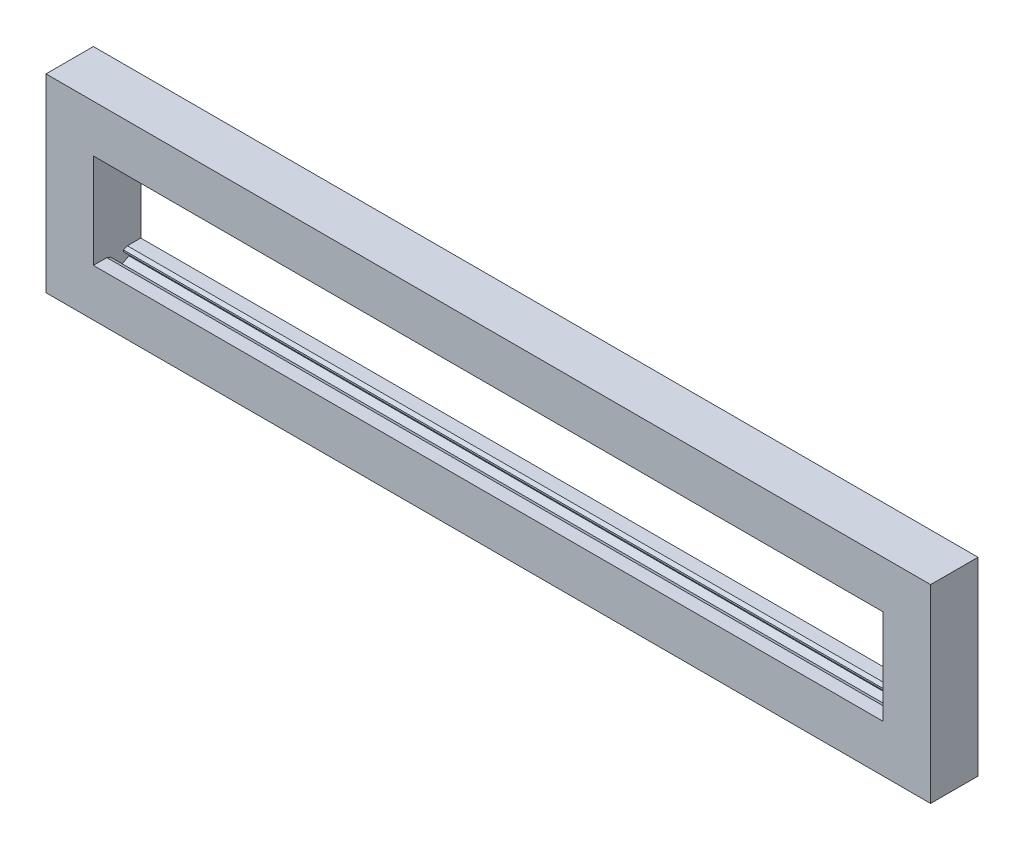
ISO-10303-21;
HEADER;
FILE_DESCRIPTION(('STEP AP214'),'2;1');
FILE_NAME('part.step','',(''),(''),'','','');
FILE_SCHEMA(('AUTOMOTIVE_DESIGN { 1 0 10303 214 1 1 1 1 }'));
ENDSEC;
DATA;
#1=APPLICATION_CONTEXT('core data for automotive mechanical design processes');
#2=APPLICATION_PROTOCOL_DEFINITION('international standard','automotive_design',2000,#1);
#3=PRODUCT_CONTEXT('',#1,'mechanical');
#4=PRODUCT('Part','Part','',(#3));
#5=PRODUCT_RELATED_PRODUCT_CATEGORY('part','',(#4));
#6=PRODUCT_DEFINITION_FORMATION('','',#4);
#7=PRODUCT_DEFINITION_CONTEXT('part definition',#1,'design');
#8=PRODUCT_DEFINITION('design','',#6,#7);
#9=PRODUCT_DEFINITION_SHAPE('','',#8);
#10=(LENGTH_UNIT() NAMED_UNIT(*) SI_UNIT(.MILLI.,.METRE.));
#11=(NAMED_UNIT(*) PLANE_ANGLE_UNIT() SI_UNIT($,.RADIAN.));
#12=(NAMED_UNIT(*) SI_UNIT($,.STERADIAN.) SOLID_ANGLE_UNIT());
#13=UNCERTAINTY_MEASURE_WITH_UNIT(LENGTH_MEASURE(1.E-05),#10,'distance_accuracy_value','');
#14=(GEOMETRIC_REPRESENTATION_CONTEXT(3) GLOBAL_UNCERTAINTY_ASSIGNED_CONTEXT((#13)) GLOBAL_UNIT_ASSIGNED_CONTEXT((#10,
#11,#12)) REPRESENTATION_CONTEXT('',''));
#15=CARTESIAN_POINT('',(0.,0.,0.));
#16=DIRECTION('',(0.,0.,1.));
#17=DIRECTION('',(1.,0.,0.));
#18=AXIS2_PLACEMENT_3D('',#15,#16,#17);
#19=CARTESIAN_POINT('',(-250.,-30.,15.));
#20=DIRECTION('',(0.,1.,0.));
#21=DIRECTION('',(0.,0.,1.));
#22=AXIS2_PLACEMENT_3D('',#19,#20,#21);
#23=PLANE('',#22);
#24=DIRECTION('',(1.,0.,0.));
#25=VECTOR('',#24,1.);
#26=CARTESIAN_POINT('',(-250.,-30.,6.49999999999999));
#27=LINE('',#26,#25);
#28=CARTESIAN_POINT('',(-250.,-30.,6.49999999999999));
#29=VERTEX_POINT('',#28);
#30=CARTESIAN_POINT('',(250.,-30.,6.49999999999999));
#31=VERTEX_POINT('',#30);
#32=EDGE_CURVE('E316',#29,#31,#27,.T.);
#33=ORIENTED_EDGE('',*,*,#32,.F.);
#34=DIRECTION('',(0.,0.,-1.));
#35=VECTOR('',#34,1.);
#36=CARTESIAN_POINT('',(-250.,-30.,15.));
#37=LINE('',#36,#35);
#38=CARTESIAN_POINT('',(-250.,-30.,15.));
#39=VERTEX_POINT('',#38);
#40=EDGE_CURVE('E432',#39,#29,#37,.T.);
#41=ORIENTED_EDGE('',*,*,#40,.F.);
#42=DIRECTION('',(1.,0.,0.));
#43=VECTOR('',#42,1.);
#44=CARTESIAN_POINT('',(-250.,-30.,15.));
#45=LINE('',#44,#43);
#46=CARTESIAN_POINT('',(250.,-30.,15.));
#47=VERTEX_POINT('',#46);
#48=EDGE_CURVE('E415',#39,#47,#45,.T.);
#49=ORIENTED_EDGE('',*,*,#48,.T.);
#50=DIRECTION('',(0.,0.,-1.));
#51=VECTOR('',#50,1.);
#52=CARTESIAN_POINT('',(250.,-30.,15.));
#53=LINE('',#52,#51);
#54=EDGE_CURVE('E428',#47,#31,#53,.T.);
#55=ORIENTED_EDGE('',*,*,#54,.T.);
#56=EDGE_LOOP('',(#33,#41,#49,#55));
#57=FACE_BOUND('',#56,.T.);
#58=ADVANCED_FACE('F36',(#57),#23,.T.);
#59=CARTESIAN_POINT('',(-250.,30.,15.));
#60=DIRECTION('',(0.,-1.,0.));
#61=DIRECTION('',(0.,0.,-1.));
#62=AXIS2_PLACEMENT_3D('',#59,#60,#61);
#63=PLANE('',#62);
#64=DIRECTION('',(1.,0.,0.));
#65=VECTOR('',#64,1.);
#66=CARTESIAN_POINT('',(-250.,30.,6.5));
#67=LINE('',#66,#65);
#68=CARTESIAN_POINT('',(-250.,30.,6.5));
#69=VERTEX_POINT('',#68);
#70=CARTESIAN_POINT('',(250.,30.,6.5));
#71=VERTEX_POINT('',#70);
#72=EDGE_CURVE('E384',#69,#71,#67,.T.);
#73=ORIENTED_EDGE('',*,*,#72,.T.);
#74=DIRECTION('',(0.,0.,-1.));
#75=VECTOR('',#74,1.);
#76=CARTESIAN_POINT('',(250.,30.,15.));
#77=LINE('',#76,#75);
#78=CARTESIAN_POINT('',(250.,30.,15.));
#79=VERTEX_POINT('',#78);
#80=EDGE_CURVE('E440',#79,#71,#77,.T.);
#81=ORIENTED_EDGE('',*,*,#80,.F.);
#82=DIRECTION('',(-1.,0.,0.));
#83=VECTOR('',#82,1.);
#84=CARTESIAN_POINT('',(-250.,30.,15.));
#85=LINE('',#84,#83);
#86=CARTESIAN_POINT('',(-250.,30.,15.));
#87=VERTEX_POINT('',#86);
#88=EDGE_CURVE('E409',#79,#87,#85,.T.);
#89=ORIENTED_EDGE('',*,*,#88,.T.);
#90=DIRECTION('',(0.,0.,-1.));
#91=VECTOR('',#90,1.);
#92=CARTESIAN_POINT('',(-250.,30.,15.));
#93=LINE('',#92,#91);
#94=EDGE_CURVE('E436',#87,#69,#93,.T.);
#95=ORIENTED_EDGE('',*,*,#94,.T.);
#96=EDGE_LOOP('',(#73,#81,#89,#95));
#97=FACE_BOUND('',#96,.T.);
#98=ADVANCED_FACE('F497',(#97),#63,.T.);
#99=CARTESIAN_POINT('',(0.,0.,15.));
#100=DIRECTION('',(0.,0.,-1.));
#101=DIRECTION('',(-1.,0.,0.));
#102=AXIS2_PLACEMENT_3D('',#99,#100,#101);
#103=PLANE('',#102);
#104=DIRECTION('',(0.,-1.,0.));
#105=VECTOR('',#104,1.);
#106=CARTESIAN_POINT('',(-280.,-60.,15.));
#107=LINE('',#106,#105);
#108=CARTESIAN_POINT('',(-280.,60.,15.));
#109=VERTEX_POINT('',#108);
#110=CARTESIAN_POINT('',(-280.,-60.,15.));
#111=VERTEX_POINT('',#110);
#112=EDGE_CURVE('E444',#109,#111,#107,.T.);
#113=ORIENTED_EDGE('',*,*,#112,.T.);
#114=DIRECTION('',(1.,0.,0.));
#115=VECTOR('',#114,1.);
#116=CARTESIAN_POINT('',(-280.,-60.,15.));
#117=LINE('',#116,#115);
#118=CARTESIAN_POINT('',(280.,-60.,15.));
#119=VERTEX_POINT('',#118);
#120=EDGE_CURVE('E447',#111,#119,#117,.T.);
#121=ORIENTED_EDGE('',*,*,#120,.T.);
#122=DIRECTION('',(0.,1.,0.));
#123=VECTOR('',#122,1.);
#124=CARTESIAN_POINT('',(280.,-60.,15.));
#125=LINE('',#124,#123);
#126=CARTESIAN_POINT('',(280.,60.,15.));
#127=VERTEX_POINT('',#126);
#128=EDGE_CURVE('E450',#119,#127,#125,.T.);
#129=ORIENTED_EDGE('',*,*,#128,.T.);
#130=DIRECTION('',(-1.,0.,0.));
#131=VECTOR('',#130,1.);
#132=CARTESIAN_POINT('',(-280.,60.,15.));
#133=LINE('',#132,#131);
#134=EDGE_CURVE('E452',#127,#109,#133,.T.);
#135=ORIENTED_EDGE('',*,*,#134,.T.);
#136=EDGE_LOOP('',(#113,#121,#129,#135));
#137=FACE_BOUND('',#136,.T.);
#138=DIRECTION('',(0.,1.,0.));
#139=VECTOR('',#138,1.);
#140=CARTESIAN_POINT('',(250.,-30.,15.));
#141=LINE('',#140,#139);
#142=EDGE_CURVE('E407',#47,#79,#141,.T.);
#143=ORIENTED_EDGE('',*,*,#142,.F.);
#144=ORIENTED_EDGE('',*,*,#48,.F.);
#145=DIRECTION('',(0.,-1.,0.));
#146=VECTOR('',#145,1.);
#147=CARTESIAN_POINT('',(-250.,-30.,15.));
#148=LINE('',#147,#146);
#149=EDGE_CURVE('E412',#87,#39,#148,.T.);
#150=ORIENTED_EDGE('',*,*,#149,.F.);
#151=ORIENTED_EDGE('',*,*,#88,.F.);
#152=EDGE_LOOP('',(#143,#144,#150,#151));
#153=FACE_BOUND('',#152,.T.);
#154=ADVANCED_FACE('F487',(#137,#153),#103,.F.);
#155=CARTESIAN_POINT('',(0.,0.,-15.));
#156=DIRECTION('',(0.,0.,-1.));
#157=DIRECTION('',(-1.,0.,0.));
#158=AXIS2_PLACEMENT_3D('',#155,#156,#157);
#159=PLANE('',#158);
#160=DIRECTION('',(0.,-1.,0.));
#161=VECTOR('',#160,1.);
#162=CARTESIAN_POINT('',(-280.,-60.,-15.));
#163=LINE('',#162,#161);
#164=CARTESIAN_POINT('',(-280.,60.,-15.));
#165=VERTEX_POINT('',#164);
#166=CARTESIAN_POINT('',(-280.,-60.,-15.));
#167=VERTEX_POINT('',#166);
#168=EDGE_CURVE('E443',#165,#167,#163,.T.);
#169=ORIENTED_EDGE('',*,*,#168,.F.);
#170=DIRECTION('',(-1.,0.,0.));
#171=VECTOR('',#170,1.);
#172=CARTESIAN_POINT('',(-280.,60.,-15.));
#173=LINE('',#172,#171);
#174=CARTESIAN_POINT('',(280.,60.,-15.));
#175=VERTEX_POINT('',#174);
#176=EDGE_CURVE('E448',#175,#165,#173,.T.);
#177=ORIENTED_EDGE('',*,*,#176,.F.);
#178=DIRECTION('',(0.,1.,0.));
#179=VECTOR('',#178,1.);
#180=CARTESIAN_POINT('',(280.,-60.,-15.));
#181=LINE('',#180,#179);
#182=CARTESIAN_POINT('',(280.,-60.,-15.));
#183=VERTEX_POINT('',#182);
#184=EDGE_CURVE('E459',#183,#175,#181,.T.);
#185=ORIENTED_EDGE('',*,*,#184,.F.);
#186=DIRECTION('',(1.,0.,0.));
#187=VECTOR('',#186,1.);
#188=CARTESIAN_POINT('',(-280.,-60.,-15.));
#189=LINE('',#188,#187);
#190=EDGE_CURVE('E457',#167,#183,#189,.T.);
#191=ORIENTED_EDGE('',*,*,#190,.F.);
#192=EDGE_LOOP('',(#169,#177,#185,#191));
#193=FACE_BOUND('',#192,.T.);
#194=DIRECTION('',(1.,0.,0.));
#195=VECTOR('',#194,1.);
#196=CARTESIAN_POINT('',(-250.,-30.,-15.));
#197=LINE('',#196,#195);
#198=CARTESIAN_POINT('',(-250.,-30.,-15.));
#199=VERTEX_POINT('',#198);
#200=CARTESIAN_POINT('',(250.,-30.,-15.));
#201=VERTEX_POINT('',#200);
#202=EDGE_CURVE('E410',#199,#201,#197,.T.);
#203=ORIENTED_EDGE('',*,*,#202,.T.);
#204=DIRECTION('',(0.,1.,0.));
#205=VECTOR('',#204,1.);
#206=CARTESIAN_POINT('',(250.,-30.,-15.));
#207=LINE('',#206,#205);
#208=CARTESIAN_POINT('',(250.,30.,-15.));
#209=VERTEX_POINT('',#208);
#210=EDGE_CURVE('E387',#201,#209,#207,.T.);
#211=ORIENTED_EDGE('',*,*,#210,.T.);
#212=DIRECTION('',(-1.,0.,0.));
#213=VECTOR('',#212,1.);
#214=CARTESIAN_POINT('',(-250.,30.,-15.));
#215=LINE('',#214,#213);
#216=CARTESIAN_POINT('',(-250.,30.,-15.));
#217=VERTEX_POINT('',#216);
#218=EDGE_CURVE('E420',#209,#217,#215,.T.);
#219=ORIENTED_EDGE('',*,*,#218,.T.);
#220=DIRECTION('',(0.,-1.,0.));
#221=VECTOR('',#220,1.);
#222=CARTESIAN_POINT('',(-250.,-30.,-15.));
#223=LINE('',#222,#221);
#224=EDGE_CURVE('E423',#217,#199,#223,.T.);
#225=ORIENTED_EDGE('',*,*,#224,.T.);
#226=EDGE_LOOP('',(#203,#211,#219,#225));
#227=FACE_BOUND('',#226,.T.);
#228=ADVANCED_FACE('F477',(#193,#227),#159,.T.);
#229=CARTESIAN_POINT('',(-280.,-60.,15.));
#230=DIRECTION('',(1.,0.,0.));
#231=DIRECTION('',(0.,0.,-1.));
#232=AXIS2_PLACEMENT_3D('',#229,#230,#231);
#233=PLANE('',#232);
#234=ORIENTED_EDGE('',*,*,#168,.T.);
#235=DIRECTION('',(0.,0.,-1.));
#236=VECTOR('',#235,1.);
#237=CARTESIAN_POINT('',(-280.,-60.,15.));
#238=LINE('',#237,#236);
#239=EDGE_CURVE('E11',#111,#167,#238,.T.);
#240=ORIENTED_EDGE('',*,*,#239,.F.);
#241=ORIENTED_EDGE('',*,*,#112,.F.);
#242=DIRECTION('',(0.,0.,-1.));
#243=VECTOR('',#242,1.);
#244=CARTESIAN_POINT('',(-280.,60.,15.));
#245=LINE('',#244,#243);
#246=EDGE_CURVE('E454',#109,#165,#245,.T.);
#247=ORIENTED_EDGE('',*,*,#246,.T.);
#248=EDGE_LOOP('',(#234,#240,#241,#247));
#249=FACE_BOUND('',#248,.T.);
#250=ADVANCED_FACE('F38',(#249),#233,.F.);
#251=CARTESIAN_POINT('',(-280.,-60.,15.));
#252=DIRECTION('',(0.,1.,0.));
#253=DIRECTION('',(0.,0.,1.));
#254=AXIS2_PLACEMENT_3D('',#251,#252,#253);
#255=PLANE('',#254);
#256=ORIENTED_EDGE('',*,*,#190,.T.);
#257=DIRECTION('',(0.,0.,-1.));
#258=VECTOR('',#257,1.);
#259=CARTESIAN_POINT('',(280.,-60.,15.));
#260=LINE('',#259,#258);
#261=EDGE_CURVE('E44',#119,#183,#260,.T.);
#262=ORIENTED_EDGE('',*,*,#261,.F.);
#263=ORIENTED_EDGE('',*,*,#120,.F.);
#264=ORIENTED_EDGE('',*,*,#239,.T.);
#265=EDGE_LOOP('',(#256,#262,#263,#264));
#266=FACE_BOUND('',#265,.T.);
#267=ADVANCED_FACE('F489',(#266),#255,.F.);
#268=CARTESIAN_POINT('',(280.,-60.,15.));
#269=DIRECTION('',(-1.,0.,0.));
#270=DIRECTION('',(0.,-1.,0.));
#271=AXIS2_PLACEMENT_3D('',#268,#269,#270);
#272=PLANE('',#271);
#273=ORIENTED_EDGE('',*,*,#184,.T.);
#274=DIRECTION('',(0.,0.,-1.));
#275=VECTOR('',#274,1.);
#276=CARTESIAN_POINT('',(280.,60.,15.));
#277=LINE('',#276,#275);
#278=EDGE_CURVE('E464',#127,#175,#277,.T.);
#279=ORIENTED_EDGE('',*,*,#278,.F.);
#280=ORIENTED_EDGE('',*,*,#128,.F.);
#281=ORIENTED_EDGE('',*,*,#261,.T.);
#282=EDGE_LOOP('',(#273,#279,#280,#281));
#283=FACE_BOUND('',#282,.T.);
#284=ADVANCED_FACE('F471',(#283),#272,.F.);
#285=CARTESIAN_POINT('',(-280.,60.,15.));
#286=DIRECTION('',(0.,-1.,0.));
#287=DIRECTION('',(0.,0.,-1.));
#288=AXIS2_PLACEMENT_3D('',#285,#286,#287);
#289=PLANE('',#288);
#290=ORIENTED_EDGE('',*,*,#176,.T.);
#291=ORIENTED_EDGE('',*,*,#246,.F.);
#292=ORIENTED_EDGE('',*,*,#134,.F.);
#293=ORIENTED_EDGE('',*,*,#278,.T.);
#294=EDGE_LOOP('',(#290,#291,#292,#293));
#295=FACE_BOUND('',#294,.T.);
#296=ADVANCED_FACE('F481',(#295),#289,.F.);
#297=CARTESIAN_POINT('',(250.,-30.,15.));
#298=DIRECTION('',(-1.,0.,0.));
#299=DIRECTION('',(0.,0.,1.));
#300=AXIS2_PLACEMENT_3D('',#297,#298,#299);
#301=PLANE('',#300);
#302=ORIENTED_EDGE('',*,*,#210,.F.);
#303=CARTESIAN_POINT('',(250.,-30.,-6.50000000000001));
#304=VERTEX_POINT('',#303);
#305=EDGE_CURVE('E417',#304,#201,#53,.T.);
#306=ORIENTED_EDGE('',*,*,#305,.F.);
#307=DIRECTION('',(0.,0.371390676354102,-0.92847669088526));
#308=VECTOR('',#307,1.);
#309=CARTESIAN_POINT('',(250.,-31.,-4.00000000000001));
#310=LINE('',#309,#308);
#311=CARTESIAN_POINT('',(250.,-31.,-4.00000000000001));
#312=VERTEX_POINT('',#311);
#313=EDGE_CURVE('E299',#312,#304,#310,.T.);
#314=ORIENTED_EDGE('',*,*,#313,.F.);
#315=DIRECTION('',(0.,1.,0.));
#316=VECTOR('',#315,1.);
#317=CARTESIAN_POINT('',(250.,-32.,-4.00000000000001));
#318=LINE('',#317,#316);
#319=CARTESIAN_POINT('',(250.,-32.,-4.00000000000001));
#320=VERTEX_POINT('',#319);
#321=EDGE_CURVE('E296',#320,#312,#318,.T.);
#322=ORIENTED_EDGE('',*,*,#321,.F.);
#323=DIRECTION('',(0.,0.,1.));
#324=VECTOR('',#323,1.);
#325=CARTESIAN_POINT('',(250.,-32.,-7.50000000000001));
#326=LINE('',#325,#324);
#327=CARTESIAN_POINT('',(250.,-32.,-7.50000000000001));
#328=VERTEX_POINT('',#327);
#329=EDGE_CURVE('E293',#328,#320,#326,.T.);
#330=ORIENTED_EDGE('',*,*,#329,.F.);
#331=DIRECTION('',(0.,1.,0.));
#332=VECTOR('',#331,1.);
#333=CARTESIAN_POINT('',(250.,-36.,-7.50000000000001));
#334=LINE('',#333,#332);
#335=CARTESIAN_POINT('',(250.,-36.,-7.50000000000001));
#336=VERTEX_POINT('',#335);
#337=EDGE_CURVE('E290',#336,#328,#334,.T.);
#338=ORIENTED_EDGE('',*,*,#337,.F.);
#339=DIRECTION('',(0.,0.470588235294118,-0.88235294117647));
#340=VECTOR('',#339,1.);
#341=CARTESIAN_POINT('',(250.,-40.,0.));
#342=LINE('',#341,#340);
#343=CARTESIAN_POINT('',(250.,-40.,0.));
#344=VERTEX_POINT('',#343);
#345=EDGE_CURVE('E288',#344,#336,#342,.T.);
#346=ORIENTED_EDGE('',*,*,#345,.F.);
#347=DIRECTION('',(0.,-0.470588235294118,-0.88235294117647));
#348=VECTOR('',#347,1.);
#349=CARTESIAN_POINT('',(250.,-36.,7.49999999999999));
#350=LINE('',#349,#348);
#351=CARTESIAN_POINT('',(250.,-36.,7.49999999999999));
#352=VERTEX_POINT('',#351);
#353=EDGE_CURVE('E244',#352,#344,#350,.T.);
#354=ORIENTED_EDGE('',*,*,#353,.F.);
#355=DIRECTION('',(0.,-1.,0.));
#356=VECTOR('',#355,1.);
#357=CARTESIAN_POINT('',(250.,-36.,7.49999999999999));
#358=LINE('',#357,#356);
#359=CARTESIAN_POINT('',(250.,-32.,7.49999999999999));
#360=VERTEX_POINT('',#359);
#361=EDGE_CURVE('E262',#360,#352,#358,.T.);
#362=ORIENTED_EDGE('',*,*,#361,.F.);
#363=DIRECTION('',(0.,0.,1.));
#364=VECTOR('',#363,1.);
#365=CARTESIAN_POINT('',(250.,-32.,3.99999999999999));
#366=LINE('',#365,#364);
#367=CARTESIAN_POINT('',(250.,-32.,3.99999999999999));
#368=VERTEX_POINT('',#367);
#369=EDGE_CURVE('E265',#368,#360,#366,.T.);
#370=ORIENTED_EDGE('',*,*,#369,.F.);
#371=DIRECTION('',(0.,-1.,0.));
#372=VECTOR('',#371,1.);
#373=CARTESIAN_POINT('',(250.,-31.,3.99999999999999));
#374=LINE('',#373,#372);
#375=CARTESIAN_POINT('',(250.,-31.,3.99999999999999));
#376=VERTEX_POINT('',#375);
#377=EDGE_CURVE('E302',#376,#368,#374,.T.);
#378=ORIENTED_EDGE('',*,*,#377,.F.);
#379=DIRECTION('',(0.,-0.371390676354102,-0.92847669088526));
#380=VECTOR('',#379,1.);
#381=CARTESIAN_POINT('',(250.,-31.,3.99999999999999));
#382=LINE('',#381,#380);
#383=EDGE_CURVE('E51',#31,#376,#382,.T.);
#384=ORIENTED_EDGE('',*,*,#383,.F.);
#385=ORIENTED_EDGE('',*,*,#54,.F.);
#386=ORIENTED_EDGE('',*,*,#142,.T.);
#387=ORIENTED_EDGE('',*,*,#80,.T.);
#388=DIRECTION('',(0.,-0.371390676354102,0.92847669088526));
#389=VECTOR('',#388,1.);
#390=CARTESIAN_POINT('',(250.,31.,4.));
#391=LINE('',#390,#389);
#392=CARTESIAN_POINT('',(250.,31.,4.));
#393=VERTEX_POINT('',#392);
#394=EDGE_CURVE('E332',#393,#71,#391,.T.);
#395=ORIENTED_EDGE('',*,*,#394,.F.);
#396=DIRECTION('',(0.,-1.,0.));
#397=VECTOR('',#396,1.);
#398=CARTESIAN_POINT('',(250.,31.,4.));
#399=LINE('',#398,#397);
#400=CARTESIAN_POINT('',(250.,32.,4.));
#401=VERTEX_POINT('',#400);
#402=EDGE_CURVE('E380',#401,#393,#399,.T.);
#403=ORIENTED_EDGE('',*,*,#402,.F.);
#404=DIRECTION('',(0.,0.,-1.));
#405=VECTOR('',#404,1.);
#406=CARTESIAN_POINT('',(250.,32.,4.));
#407=LINE('',#406,#405);
#408=CARTESIAN_POINT('',(250.,32.,7.5));
#409=VERTEX_POINT('',#408);
#410=EDGE_CURVE('E377',#409,#401,#407,.T.);
#411=ORIENTED_EDGE('',*,*,#410,.F.);
#412=DIRECTION('',(0.,-1.,0.));
#413=VECTOR('',#412,1.);
#414=CARTESIAN_POINT('',(250.,36.,7.5));
#415=LINE('',#414,#413);
#416=CARTESIAN_POINT('',(250.,36.,7.5));
#417=VERTEX_POINT('',#416);
#418=EDGE_CURVE('E374',#417,#409,#415,.T.);
#419=ORIENTED_EDGE('',*,*,#418,.F.);
#420=DIRECTION('',(0.,-0.470588235294118,0.882352941176471));
#421=VECTOR('',#420,1.);
#422=CARTESIAN_POINT('',(250.,36.,7.5));
#423=LINE('',#422,#421);
#424=CARTESIAN_POINT('',(250.,40.,0.));
#425=VERTEX_POINT('',#424);
#426=EDGE_CURVE('E371',#425,#417,#423,.T.);
#427=ORIENTED_EDGE('',*,*,#426,.F.);
#428=DIRECTION('',(0.,0.470588235294118,0.882352941176471));
#429=VECTOR('',#428,1.);
#430=CARTESIAN_POINT('',(250.,40.,0.));
#431=LINE('',#430,#429);
#432=CARTESIAN_POINT('',(250.,36.,-7.5));
#433=VERTEX_POINT('',#432);
#434=EDGE_CURVE('E368',#433,#425,#431,.T.);
#435=ORIENTED_EDGE('',*,*,#434,.F.);
#436=DIRECTION('',(0.,1.,0.));
#437=VECTOR('',#436,1.);
#438=CARTESIAN_POINT('',(250.,36.,-7.5));
#439=LINE('',#438,#437);
#440=CARTESIAN_POINT('',(250.,32.,-7.5));
#441=VERTEX_POINT('',#440);
#442=EDGE_CURVE('E365',#441,#433,#439,.T.);
#443=ORIENTED_EDGE('',*,*,#442,.F.);
#444=DIRECTION('',(0.,0.,-1.));
#445=VECTOR('',#444,1.);
#446=CARTESIAN_POINT('',(250.,32.,-7.5));
#447=LINE('',#446,#445);
#448=CARTESIAN_POINT('',(250.,32.,-4.));
#449=VERTEX_POINT('',#448);
#450=EDGE_CURVE('E362',#449,#441,#447,.T.);
#451=ORIENTED_EDGE('',*,*,#450,.F.);
#452=DIRECTION('',(0.,1.,0.));
#453=VECTOR('',#452,1.);
#454=CARTESIAN_POINT('',(250.,32.,-4.));
#455=LINE('',#454,#453);
#456=CARTESIAN_POINT('',(250.,31.,-4.));
#457=VERTEX_POINT('',#456);
#458=EDGE_CURVE('E359',#457,#449,#455,.T.);
#459=ORIENTED_EDGE('',*,*,#458,.F.);
#460=DIRECTION('',(0.,0.371390676354102,0.92847669088526));
#461=VECTOR('',#460,1.);
#462=CARTESIAN_POINT('',(250.,31.,-4.));
#463=LINE('',#462,#461);
#464=CARTESIAN_POINT('',(250.,30.,-6.5));
#465=VERTEX_POINT('',#464);
#466=EDGE_CURVE('E309',#465,#457,#463,.T.);
#467=ORIENTED_EDGE('',*,*,#466,.F.);
#468=EDGE_CURVE('E439',#465,#209,#77,.T.);
#469=ORIENTED_EDGE('',*,*,#468,.T.);
#470=EDGE_LOOP('',(#302,#306,#314,#322,#330,#338,#346,#354,#362,#370,#378,#384,#385,#386,#387,
#395,#403,#411,#419,#427,#435,#443,#451,#459,#467,#469));
#471=FACE_BOUND('',#470,.T.);
#472=ADVANCED_FACE('F527',(#471),#301,.T.);
#473=DIRECTION('',(1.,0.,0.));
#474=VECTOR('',#473,1.);
#475=CARTESIAN_POINT('',(-250.,30.,-6.5));
#476=LINE('',#475,#474);
#477=CARTESIAN_POINT('',(-250.,30.,-6.5));
#478=VERTEX_POINT('',#477);
#479=EDGE_CURVE('E356',#478,#465,#476,.T.);
#480=ORIENTED_EDGE('',*,*,#479,.F.);
#481=EDGE_CURVE('E435',#478,#217,#93,.T.);
#482=ORIENTED_EDGE('',*,*,#481,.T.);
#483=ORIENTED_EDGE('',*,*,#218,.F.);
#484=ORIENTED_EDGE('',*,*,#468,.F.);
#485=EDGE_LOOP('',(#480,#482,#483,#484));
#486=FACE_BOUND('',#485,.T.);
#487=ADVANCED_FACE('F506',(#486),#63,.T.);
#488=CARTESIAN_POINT('',(-250.,-30.,15.));
#489=DIRECTION('',(1.,0.,0.));
#490=DIRECTION('',(0.,0.,-1.));
#491=AXIS2_PLACEMENT_3D('',#488,#489,#490);
#492=PLANE('',#491);
#493=ORIENTED_EDGE('',*,*,#224,.F.);
#494=ORIENTED_EDGE('',*,*,#481,.F.);
#495=DIRECTION('',(0.,0.371390676354102,0.92847669088526));
#496=VECTOR('',#495,1.);
#497=CARTESIAN_POINT('',(-250.,31.,-4.));
#498=LINE('',#497,#496);
#499=CARTESIAN_POINT('',(-250.,31.,-4.));
#500=VERTEX_POINT('',#499);
#501=EDGE_CURVE('E328',#478,#500,#498,.T.);
#502=ORIENTED_EDGE('',*,*,#501,.T.);
#503=DIRECTION('',(0.,1.,0.));
#504=VECTOR('',#503,1.);
#505=CARTESIAN_POINT('',(-250.,32.,-4.));
#506=LINE('',#505,#504);
#507=CARTESIAN_POINT('',(-250.,32.,-4.));
#508=VERTEX_POINT('',#507);
#509=EDGE_CURVE('E331',#500,#508,#506,.T.);
#510=ORIENTED_EDGE('',*,*,#509,.T.);
#511=DIRECTION('',(0.,0.,-1.));
#512=VECTOR('',#511,1.);
#513=CARTESIAN_POINT('',(-250.,32.,-7.5));
#514=LINE('',#513,#512);
#515=CARTESIAN_POINT('',(-250.,32.,-7.5));
#516=VERTEX_POINT('',#515);
#517=EDGE_CURVE('E335',#508,#516,#514,.T.);
#518=ORIENTED_EDGE('',*,*,#517,.T.);
#519=DIRECTION('',(0.,1.,0.));
#520=VECTOR('',#519,1.);
#521=CARTESIAN_POINT('',(-250.,36.,-7.5));
#522=LINE('',#521,#520);
#523=CARTESIAN_POINT('',(-250.,36.,-7.5));
#524=VERTEX_POINT('',#523);
#525=EDGE_CURVE('E338',#516,#524,#522,.T.);
#526=ORIENTED_EDGE('',*,*,#525,.T.);
#527=DIRECTION('',(0.,0.470588235294118,0.882352941176471));
#528=VECTOR('',#527,1.);
#529=CARTESIAN_POINT('',(-250.,40.,0.));
#530=LINE('',#529,#528);
#531=CARTESIAN_POINT('',(-250.,40.,0.));
#532=VERTEX_POINT('',#531);
#533=EDGE_CURVE('E341',#524,#532,#530,.T.);
#534=ORIENTED_EDGE('',*,*,#533,.T.);
#535=DIRECTION('',(0.,-0.470588235294118,0.882352941176471));
#536=VECTOR('',#535,1.);
#537=CARTESIAN_POINT('',(-250.,36.,7.5));
#538=LINE('',#537,#536);
#539=CARTESIAN_POINT('',(-250.,36.,7.5));
#540=VERTEX_POINT('',#539);
#541=EDGE_CURVE('E344',#532,#540,#538,.T.);
#542=ORIENTED_EDGE('',*,*,#541,.T.);
#543=DIRECTION('',(0.,-1.,0.));
#544=VECTOR('',#543,1.);
#545=CARTESIAN_POINT('',(-250.,36.,7.5));
#546=LINE('',#545,#544);
#547=CARTESIAN_POINT('',(-250.,32.,7.5));
#548=VERTEX_POINT('',#547);
#549=EDGE_CURVE('E347',#540,#548,#546,.T.);
#550=ORIENTED_EDGE('',*,*,#549,.T.);
#551=DIRECTION('',(0.,0.,-1.));
#552=VECTOR('',#551,1.);
#553=CARTESIAN_POINT('',(-250.,32.,4.));
#554=LINE('',#553,#552);
#555=CARTESIAN_POINT('',(-250.,32.,4.));
#556=VERTEX_POINT('',#555);
#557=EDGE_CURVE('E350',#548,#556,#554,.T.);
#558=ORIENTED_EDGE('',*,*,#557,.T.);
#559=DIRECTION('',(0.,-1.,0.));
#560=VECTOR('',#559,1.);
#561=CARTESIAN_POINT('',(-250.,31.,4.));
#562=LINE('',#561,#560);
#563=CARTESIAN_POINT('',(-250.,31.,4.));
#564=VERTEX_POINT('',#563);
#565=EDGE_CURVE('E353',#556,#564,#562,.T.);
#566=ORIENTED_EDGE('',*,*,#565,.T.);
#567=DIRECTION('',(0.,-0.371390676354102,0.92847669088526));
#568=VECTOR('',#567,1.);
#569=CARTESIAN_POINT('',(-250.,31.,4.));
#570=LINE('',#569,#568);
#571=EDGE_CURVE('E59',#564,#69,#570,.T.);
#572=ORIENTED_EDGE('',*,*,#571,.T.);
#573=ORIENTED_EDGE('',*,*,#94,.F.);
#574=ORIENTED_EDGE('',*,*,#149,.T.);
#575=ORIENTED_EDGE('',*,*,#40,.T.);
#576=DIRECTION('',(0.,-0.371390676354102,-0.92847669088526));
#577=VECTOR('',#576,1.);
#578=CARTESIAN_POINT('',(-250.,-31.,3.99999999999999));
#579=LINE('',#578,#577);
#580=CARTESIAN_POINT('',(-250.,-31.,3.99999999999999));
#581=VERTEX_POINT('',#580);
#582=EDGE_CURVE('E278',#29,#581,#579,.T.);
#583=ORIENTED_EDGE('',*,*,#582,.T.);
#584=DIRECTION('',(0.,-1.,0.));
#585=VECTOR('',#584,1.);
#586=CARTESIAN_POINT('',(-250.,-31.,3.99999999999999));
#587=LINE('',#586,#585);
#588=CARTESIAN_POINT('',(-250.,-32.,3.99999999999999));
#589=VERTEX_POINT('',#588);
#590=EDGE_CURVE('E281',#581,#589,#587,.T.);
#591=ORIENTED_EDGE('',*,*,#590,.T.);
#592=DIRECTION('',(0.,0.,1.));
#593=VECTOR('',#592,1.);
#594=CARTESIAN_POINT('',(-250.,-32.,3.99999999999999));
#595=LINE('',#594,#593);
#596=CARTESIAN_POINT('',(-250.,-32.,7.49999999999999));
#597=VERTEX_POINT('',#596);
#598=EDGE_CURVE('E284',#589,#597,#595,.T.);
#599=ORIENTED_EDGE('',*,*,#598,.T.);
#600=DIRECTION('',(0.,-1.,0.));
#601=VECTOR('',#600,1.);
#602=CARTESIAN_POINT('',(-250.,-36.,7.49999999999999));
#603=LINE('',#602,#601);
#604=CARTESIAN_POINT('',(-250.,-36.,7.49999999999999));
#605=VERTEX_POINT('',#604);
#606=EDGE_CURVE('E249',#597,#605,#603,.T.);
#607=ORIENTED_EDGE('',*,*,#606,.T.);
#608=DIRECTION('',(0.,-0.470588235294118,-0.88235294117647));
#609=VECTOR('',#608,1.);
#610=CARTESIAN_POINT('',(-250.,-36.,7.49999999999999));
#611=LINE('',#610,#609);
#612=CARTESIAN_POINT('',(-250.,-40.,0.));
#613=VERTEX_POINT('',#612);
#614=EDGE_CURVE('E241',#605,#613,#611,.T.);
#615=ORIENTED_EDGE('',*,*,#614,.T.);
#616=DIRECTION('',(0.,0.470588235294118,-0.88235294117647));
#617=VECTOR('',#616,1.);
#618=CARTESIAN_POINT('',(-250.,-40.,0.));
#619=LINE('',#618,#617);
#620=CARTESIAN_POINT('',(-250.,-36.,-7.50000000000001));
#621=VERTEX_POINT('',#620);
#622=EDGE_CURVE('E252',#613,#621,#619,.T.);
#623=ORIENTED_EDGE('',*,*,#622,.T.);
#624=DIRECTION('',(0.,1.,0.));
#625=VECTOR('',#624,1.);
#626=CARTESIAN_POINT('',(-250.,-36.,-7.50000000000001));
#627=LINE('',#626,#625);
#628=CARTESIAN_POINT('',(-250.,-32.,-7.50000000000001));
#629=VERTEX_POINT('',#628);
#630=EDGE_CURVE('E256',#621,#629,#627,.T.);
#631=ORIENTED_EDGE('',*,*,#630,.T.);
#632=DIRECTION('',(0.,0.,1.));
#633=VECTOR('',#632,1.);
#634=CARTESIAN_POINT('',(-250.,-32.,-7.50000000000001));
#635=LINE('',#634,#633);
#636=CARTESIAN_POINT('',(-250.,-32.,-4.00000000000001));
#637=VERTEX_POINT('',#636);
#638=EDGE_CURVE('E269',#629,#637,#635,.T.);
#639=ORIENTED_EDGE('',*,*,#638,.T.);
#640=DIRECTION('',(0.,1.,0.));
#641=VECTOR('',#640,1.);
#642=CARTESIAN_POINT('',(-250.,-32.,-4.00000000000001));
#643=LINE('',#642,#641);
#644=CARTESIAN_POINT('',(-250.,-31.,-4.00000000000001));
#645=VERTEX_POINT('',#644);
#646=EDGE_CURVE('E272',#637,#645,#643,.T.);
#647=ORIENTED_EDGE('',*,*,#646,.T.);
#648=DIRECTION('',(0.,0.371390676354102,-0.92847669088526));
#649=VECTOR('',#648,1.);
#650=CARTESIAN_POINT('',(-250.,-31.,-4.00000000000001));
#651=LINE('',#650,#649);
#652=CARTESIAN_POINT('',(-250.,-30.,-6.50000000000001));
#653=VERTEX_POINT('',#652);
#654=EDGE_CURVE('E275',#645,#653,#651,.T.);
#655=ORIENTED_EDGE('',*,*,#654,.T.);
#656=EDGE_CURVE('E431',#653,#199,#37,.T.);
#657=ORIENTED_EDGE('',*,*,#656,.T.);
#658=EDGE_LOOP('',(#493,#494,#502,#510,#518,#526,#534,#542,#550,#558,#566,#572,#573,#574,#575,
#583,#591,#599,#607,#615,#623,#631,#639,#647,#655,#657));
#659=FACE_BOUND('',#658,.T.);
#660=ADVANCED_FACE('F259',(#659),#492,.T.);
#661=DIRECTION('',(1.,0.,0.));
#662=VECTOR('',#661,1.);
#663=CARTESIAN_POINT('',(-250.,-30.,-6.50000000000001));
#664=LINE('',#663,#662);
#665=EDGE_CURVE('E318',#653,#304,#664,.T.);
#666=ORIENTED_EDGE('',*,*,#665,.T.);
#667=ORIENTED_EDGE('',*,*,#305,.T.);
#668=ORIENTED_EDGE('',*,*,#202,.F.);
#669=ORIENTED_EDGE('',*,*,#656,.F.);
#670=EDGE_LOOP('',(#666,#667,#668,#669));
#671=FACE_BOUND('',#670,.T.);
#672=ADVANCED_FACE('F500',(#671),#23,.T.);
#673=CARTESIAN_POINT('',(-250.,31.,4.));
#674=DIRECTION('',(0.,0.92847669088526,0.371390676354102));
#675=DIRECTION('',(0.,-0.371390676354102,0.92847669088526));
#676=AXIS2_PLACEMENT_3D('',#673,#674,#675);
#677=PLANE('',#676);
#678=ORIENTED_EDGE('',*,*,#394,.T.);
#679=ORIENTED_EDGE('',*,*,#72,.F.);
#680=ORIENTED_EDGE('',*,*,#571,.F.);
#681=DIRECTION('',(1.,0.,0.));
#682=VECTOR('',#681,1.);
#683=CARTESIAN_POINT('',(-250.,31.,4.));
#684=LINE('',#683,#682);
#685=EDGE_CURVE('E388',#564,#393,#684,.T.);
#686=ORIENTED_EDGE('',*,*,#685,.T.);
#687=EDGE_LOOP('',(#678,#679,#680,#686));
#688=FACE_BOUND('',#687,.T.);
#689=ADVANCED_FACE('F511',(#688),#677,.F.);
#690=CARTESIAN_POINT('',(-250.,31.,4.));
#691=DIRECTION('',(0.,0.,1.));
#692=DIRECTION('',(1.,0.,0.));
#693=AXIS2_PLACEMENT_3D('',#690,#691,#692);
#694=PLANE('',#693);
#695=ORIENTED_EDGE('',*,*,#402,.T.);
#696=ORIENTED_EDGE('',*,*,#685,.F.);
#697=ORIENTED_EDGE('',*,*,#565,.F.);
#698=DIRECTION('',(1.,0.,0.));
#699=VECTOR('',#698,1.);
#700=CARTESIAN_POINT('',(-250.,32.,4.));
#701=LINE('',#700,#699);
#702=EDGE_CURVE('E390',#556,#401,#701,.T.);
#703=ORIENTED_EDGE('',*,*,#702,.T.);
#704=EDGE_LOOP('',(#695,#696,#697,#703));
#705=FACE_BOUND('',#704,.T.);
#706=ADVANCED_FACE('F517',(#705),#694,.F.);
#707=CARTESIAN_POINT('',(-250.,32.,4.));
#708=DIRECTION('',(0.,-1.,0.));
#709=DIRECTION('',(0.,0.,-1.));
#710=AXIS2_PLACEMENT_3D('',#707,#708,#709);
#711=PLANE('',#710);
#712=ORIENTED_EDGE('',*,*,#410,.T.);
#713=ORIENTED_EDGE('',*,*,#702,.F.);
#714=ORIENTED_EDGE('',*,*,#557,.F.);
#715=DIRECTION('',(1.,0.,0.));
#716=VECTOR('',#715,1.);
#717=CARTESIAN_POINT('',(-250.,32.,7.5));
#718=LINE('',#717,#716);
#719=EDGE_CURVE('E392',#548,#409,#718,.T.);
#720=ORIENTED_EDGE('',*,*,#719,.T.);
#721=EDGE_LOOP('',(#712,#713,#714,#720));
#722=FACE_BOUND('',#721,.T.);
#723=ADVANCED_FACE('F568',(#722),#711,.F.);
#724=CARTESIAN_POINT('',(-250.,36.,7.5));
#725=DIRECTION('',(0.,0.,1.));
#726=DIRECTION('',(1.,0.,0.));
#727=AXIS2_PLACEMENT_3D('',#724,#725,#726);
#728=PLANE('',#727);
#729=ORIENTED_EDGE('',*,*,#418,.T.);
#730=ORIENTED_EDGE('',*,*,#719,.F.);
#731=ORIENTED_EDGE('',*,*,#549,.F.);
#732=DIRECTION('',(1.,0.,0.));
#733=VECTOR('',#732,1.);
#734=CARTESIAN_POINT('',(-250.,36.,7.5));
#735=LINE('',#734,#733);
#736=EDGE_CURVE('E394',#540,#417,#735,.T.);
#737=ORIENTED_EDGE('',*,*,#736,.T.);
#738=EDGE_LOOP('',(#729,#730,#731,#737));
#739=FACE_BOUND('',#738,.T.);
#740=ADVANCED_FACE('F572',(#739),#728,.F.);
#741=CARTESIAN_POINT('',(-250.,36.,7.5));
#742=DIRECTION('',(0.,0.88235294117647,0.470588235294118));
#743=DIRECTION('',(0.,-0.470588235294118,0.88235294117647));
#744=AXIS2_PLACEMENT_3D('',#741,#742,#743);
#745=PLANE('',#744);
#746=ORIENTED_EDGE('',*,*,#426,.T.);
#747=ORIENTED_EDGE('',*,*,#736,.F.);
#748=ORIENTED_EDGE('',*,*,#541,.F.);
#749=DIRECTION('',(1.,0.,0.));
#750=VECTOR('',#749,1.);
#751=CARTESIAN_POINT('',(-250.,40.,0.));
#752=LINE('',#751,#750);
#753=EDGE_CURVE('E396',#532,#425,#752,.T.);
#754=ORIENTED_EDGE('',*,*,#753,.T.);
#755=EDGE_LOOP('',(#746,#747,#748,#754));
#756=FACE_BOUND('',#755,.T.);
#757=ADVANCED_FACE('F576',(#756),#745,.F.);
#758=CARTESIAN_POINT('',(-250.,40.,0.));
#759=DIRECTION('',(0.,0.88235294117647,-0.470588235294118));
#760=DIRECTION('',(0.,0.470588235294118,0.88235294117647));
#761=AXIS2_PLACEMENT_3D('',#758,#759,#760);
#762=PLANE('',#761);
#763=ORIENTED_EDGE('',*,*,#434,.T.);
#764=ORIENTED_EDGE('',*,*,#753,.F.);
#765=ORIENTED_EDGE('',*,*,#533,.F.);
#766=DIRECTION('',(1.,0.,0.));
#767=VECTOR('',#766,1.);
#768=CARTESIAN_POINT('',(-250.,36.,-7.5));
#769=LINE('',#768,#767);
#770=EDGE_CURVE('E398',#524,#433,#769,.T.);
#771=ORIENTED_EDGE('',*,*,#770,.T.);
#772=EDGE_LOOP('',(#763,#764,#765,#771));
#773=FACE_BOUND('',#772,.T.);
#774=ADVANCED_FACE('F580',(#773),#762,.F.);
#775=CARTESIAN_POINT('',(-250.,36.,-7.5));
#776=DIRECTION('',(0.,0.,-1.));
#777=DIRECTION('',(-1.,0.,0.));
#778=AXIS2_PLACEMENT_3D('',#775,#776,#777);
#779=PLANE('',#778);
#780=ORIENTED_EDGE('',*,*,#442,.T.);
#781=ORIENTED_EDGE('',*,*,#770,.F.);
#782=ORIENTED_EDGE('',*,*,#525,.F.);
#783=DIRECTION('',(1.,0.,0.));
#784=VECTOR('',#783,1.);
#785=CARTESIAN_POINT('',(-250.,32.,-7.5));
#786=LINE('',#785,#784);
#787=EDGE_CURVE('E400',#516,#441,#786,.T.);
#788=ORIENTED_EDGE('',*,*,#787,.T.);
#789=EDGE_LOOP('',(#780,#781,#782,#788));
#790=FACE_BOUND('',#789,.T.);
#791=ADVANCED_FACE('F584',(#790),#779,.F.);
#792=CARTESIAN_POINT('',(-250.,32.,-7.5));
#793=DIRECTION('',(0.,-1.,0.));
#794=DIRECTION('',(0.,0.,-1.));
#795=AXIS2_PLACEMENT_3D('',#792,#793,#794);
#796=PLANE('',#795);
#797=ORIENTED_EDGE('',*,*,#450,.T.);
#798=ORIENTED_EDGE('',*,*,#787,.F.);
#799=ORIENTED_EDGE('',*,*,#517,.F.);
#800=DIRECTION('',(1.,0.,0.));
#801=VECTOR('',#800,1.);
#802=CARTESIAN_POINT('',(-250.,32.,-4.));
#803=LINE('',#802,#801);
#804=EDGE_CURVE('E402',#508,#449,#803,.T.);
#805=ORIENTED_EDGE('',*,*,#804,.T.);
#806=EDGE_LOOP('',(#797,#798,#799,#805));
#807=FACE_BOUND('',#806,.T.);
#808=ADVANCED_FACE('F588',(#807),#796,.F.);
#809=CARTESIAN_POINT('',(-250.,32.,-4.));
#810=DIRECTION('',(0.,0.,-1.));
#811=DIRECTION('',(-1.,0.,0.));
#812=AXIS2_PLACEMENT_3D('',#809,#810,#811);
#813=PLANE('',#812);
#814=ORIENTED_EDGE('',*,*,#458,.T.);
#815=ORIENTED_EDGE('',*,*,#804,.F.);
#816=ORIENTED_EDGE('',*,*,#509,.F.);
#817=DIRECTION('',(1.,0.,0.));
#818=VECTOR('',#817,1.);
#819=CARTESIAN_POINT('',(-250.,31.,-4.));
#820=LINE('',#819,#818);
#821=EDGE_CURVE('E404',#500,#457,#820,.T.);
#822=ORIENTED_EDGE('',*,*,#821,.T.);
#823=EDGE_LOOP('',(#814,#815,#816,#822));
#824=FACE_BOUND('',#823,.T.);
#825=ADVANCED_FACE('F592',(#824),#813,.F.);
#826=CARTESIAN_POINT('',(-250.,31.,-4.));
#827=DIRECTION('',(0.,0.92847669088526,-0.371390676354102));
#828=DIRECTION('',(0.,0.371390676354102,0.92847669088526));
#829=AXIS2_PLACEMENT_3D('',#826,#827,#828);
#830=PLANE('',#829);
#831=ORIENTED_EDGE('',*,*,#466,.T.);
#832=ORIENTED_EDGE('',*,*,#821,.F.);
#833=ORIENTED_EDGE('',*,*,#501,.F.);
#834=ORIENTED_EDGE('',*,*,#479,.T.);
#835=EDGE_LOOP('',(#831,#832,#833,#834));
#836=FACE_BOUND('',#835,.T.);
#837=ADVANCED_FACE('F594',(#836),#830,.F.);
#838=CARTESIAN_POINT('',(-250.,-36.,7.49999999999999));
#839=DIRECTION('',(0.,-0.88235294117647,0.470588235294118));
#840=DIRECTION('',(0.,-0.470588235294118,-0.88235294117647));
#841=AXIS2_PLACEMENT_3D('',#838,#839,#840);
#842=PLANE('',#841);
#843=ORIENTED_EDGE('',*,*,#353,.T.);
#844=DIRECTION('',(1.,0.,0.));
#845=VECTOR('',#844,1.);
#846=CARTESIAN_POINT('',(-250.,-40.,0.));
#847=LINE('',#846,#845);
#848=EDGE_CURVE('E237',#613,#344,#847,.T.);
#849=ORIENTED_EDGE('',*,*,#848,.F.);
#850=ORIENTED_EDGE('',*,*,#614,.F.);
#851=DIRECTION('',(1.,0.,0.));
#852=VECTOR('',#851,1.);
#853=CARTESIAN_POINT('',(-250.,-36.,7.49999999999999));
#854=LINE('',#853,#852);
#855=EDGE_CURVE('E307',#605,#352,#854,.T.);
#856=ORIENTED_EDGE('',*,*,#855,.T.);
#857=EDGE_LOOP('',(#843,#849,#850,#856));
#858=FACE_BOUND('',#857,.T.);
#859=ADVANCED_FACE('F239',(#858),#842,.F.);
#860=CARTESIAN_POINT('',(-250.,-36.,7.49999999999999));
#861=DIRECTION('',(0.,0.,1.));
#862=DIRECTION('',(0.,-1.,0.));
#863=AXIS2_PLACEMENT_3D('',#860,#861,#862);
#864=PLANE('',#863);
#865=ORIENTED_EDGE('',*,*,#361,.T.);
#866=ORIENTED_EDGE('',*,*,#855,.F.);
#867=ORIENTED_EDGE('',*,*,#606,.F.);
#868=DIRECTION('',(1.,0.,0.));
#869=VECTOR('',#868,1.);
#870=CARTESIAN_POINT('',(-250.,-32.,7.49999999999999));
#871=LINE('',#870,#869);
#872=EDGE_CURVE('E310',#597,#360,#871,.T.);
#873=ORIENTED_EDGE('',*,*,#872,.T.);
#874=EDGE_LOOP('',(#865,#866,#867,#873));
#875=FACE_BOUND('',#874,.T.);
#876=ADVANCED_FACE('F547',(#875),#864,.F.);
#877=CARTESIAN_POINT('',(-250.,-32.,3.99999999999999));
#878=DIRECTION('',(0.,1.,0.));
#879=DIRECTION('',(0.,0.,1.));
#880=AXIS2_PLACEMENT_3D('',#877,#878,#879);
#881=PLANE('',#880);
#882=ORIENTED_EDGE('',*,*,#369,.T.);
#883=ORIENTED_EDGE('',*,*,#872,.F.);
#884=ORIENTED_EDGE('',*,*,#598,.F.);
#885=DIRECTION('',(1.,0.,0.));
#886=VECTOR('',#885,1.);
#887=CARTESIAN_POINT('',(-250.,-32.,3.99999999999999));
#888=LINE('',#887,#886);
#889=EDGE_CURVE('E312',#589,#368,#888,.T.);
#890=ORIENTED_EDGE('',*,*,#889,.T.);
#891=EDGE_LOOP('',(#882,#883,#884,#890));
#892=FACE_BOUND('',#891,.T.);
#893=ADVANCED_FACE('F550',(#892),#881,.F.);
#894=CARTESIAN_POINT('',(-250.,-31.,3.99999999999999));
#895=DIRECTION('',(0.,0.,1.));
#896=DIRECTION('',(1.,0.,0.));
#897=AXIS2_PLACEMENT_3D('',#894,#895,#896);
#898=PLANE('',#897);
#899=ORIENTED_EDGE('',*,*,#377,.T.);
#900=ORIENTED_EDGE('',*,*,#889,.F.);
#901=ORIENTED_EDGE('',*,*,#590,.F.);
#902=DIRECTION('',(1.,0.,0.));
#903=VECTOR('',#902,1.);
#904=CARTESIAN_POINT('',(-250.,-31.,3.99999999999999));
#905=LINE('',#904,#903);
#906=EDGE_CURVE('E314',#581,#376,#905,.T.);
#907=ORIENTED_EDGE('',*,*,#906,.T.);
#908=EDGE_LOOP('',(#899,#900,#901,#907));
#909=FACE_BOUND('',#908,.T.);
#910=ADVANCED_FACE('F552',(#909),#898,.F.);
#911=CARTESIAN_POINT('',(-250.,-31.,3.99999999999999));
#912=DIRECTION('',(0.,-0.92847669088526,0.371390676354102));
#913=DIRECTION('',(0.,-0.371390676354102,-0.92847669088526));
#914=AXIS2_PLACEMENT_3D('',#911,#912,#913);
#915=PLANE('',#914);
#916=ORIENTED_EDGE('',*,*,#383,.T.);
#917=ORIENTED_EDGE('',*,*,#906,.F.);
#918=ORIENTED_EDGE('',*,*,#582,.F.);
#919=ORIENTED_EDGE('',*,*,#32,.T.);
#920=EDGE_LOOP('',(#916,#917,#918,#919));
#921=FACE_BOUND('',#920,.T.);
#922=ADVANCED_FACE('F555',(#921),#915,.F.);
#923=CARTESIAN_POINT('',(-250.,-31.,-4.00000000000001));
#924=DIRECTION('',(0.,-0.92847669088526,-0.371390676354102));
#925=DIRECTION('',(0.,0.371390676354102,-0.92847669088526));
#926=AXIS2_PLACEMENT_3D('',#923,#924,#925);
#927=PLANE('',#926);
#928=ORIENTED_EDGE('',*,*,#313,.T.);
#929=ORIENTED_EDGE('',*,*,#665,.F.);
#930=ORIENTED_EDGE('',*,*,#654,.F.);
#931=DIRECTION('',(1.,0.,0.));
#932=VECTOR('',#931,1.);
#933=CARTESIAN_POINT('',(-250.,-31.,-4.00000000000001));
#934=LINE('',#933,#932);
#935=EDGE_CURVE('E321',#645,#312,#934,.T.);
#936=ORIENTED_EDGE('',*,*,#935,.T.);
#937=EDGE_LOOP('',(#928,#929,#930,#936));
#938=FACE_BOUND('',#937,.T.);
#939=ADVANCED_FACE('F534',(#938),#927,.F.);
#940=CARTESIAN_POINT('',(-250.,-32.,-4.00000000000001));
#941=DIRECTION('',(0.,0.,-1.));
#942=DIRECTION('',(-1.,0.,0.));
#943=AXIS2_PLACEMENT_3D('',#940,#941,#942);
#944=PLANE('',#943);
#945=ORIENTED_EDGE('',*,*,#321,.T.);
#946=ORIENTED_EDGE('',*,*,#935,.F.);
#947=ORIENTED_EDGE('',*,*,#646,.F.);
#948=DIRECTION('',(1.,0.,0.));
#949=VECTOR('',#948,1.);
#950=CARTESIAN_POINT('',(-250.,-32.,-4.00000000000001));
#951=LINE('',#950,#949);
#952=EDGE_CURVE('E323',#637,#320,#951,.T.);
#953=ORIENTED_EDGE('',*,*,#952,.T.);
#954=EDGE_LOOP('',(#945,#946,#947,#953));
#955=FACE_BOUND('',#954,.T.);
#956=ADVANCED_FACE('F536',(#955),#944,.F.);
#957=CARTESIAN_POINT('',(-250.,-32.,-7.50000000000001));
#958=DIRECTION('',(0.,1.,0.));
#959=DIRECTION('',(0.,0.,1.));
#960=AXIS2_PLACEMENT_3D('',#957,#958,#959);
#961=PLANE('',#960);
#962=ORIENTED_EDGE('',*,*,#329,.T.);
#963=ORIENTED_EDGE('',*,*,#952,.F.);
#964=ORIENTED_EDGE('',*,*,#638,.F.);
#965=DIRECTION('',(1.,0.,0.));
#966=VECTOR('',#965,1.);
#967=CARTESIAN_POINT('',(-250.,-32.,-7.50000000000001));
#968=LINE('',#967,#966);
#969=EDGE_CURVE('E325',#629,#328,#968,.T.);
#970=ORIENTED_EDGE('',*,*,#969,.T.);
#971=EDGE_LOOP('',(#962,#963,#964,#970));
#972=FACE_BOUND('',#971,.T.);
#973=ADVANCED_FACE('F540',(#972),#961,.F.);
#974=CARTESIAN_POINT('',(-250.,-36.,-7.50000000000001));
#975=DIRECTION('',(0.,0.,-1.));
#976=DIRECTION('',(0.,1.,0.));
#977=AXIS2_PLACEMENT_3D('',#974,#975,#976);
#978=PLANE('',#977);
#979=ORIENTED_EDGE('',*,*,#337,.T.);
#980=ORIENTED_EDGE('',*,*,#969,.F.);
#981=ORIENTED_EDGE('',*,*,#630,.F.);
#982=DIRECTION('',(1.,0.,0.));
#983=VECTOR('',#982,1.);
#984=CARTESIAN_POINT('',(-250.,-36.,-7.50000000000001));
#985=LINE('',#984,#983);
#986=EDGE_CURVE('E248',#621,#336,#985,.T.);
#987=ORIENTED_EDGE('',*,*,#986,.T.);
#988=EDGE_LOOP('',(#979,#980,#981,#987));
#989=FACE_BOUND('',#988,.T.);
#990=ADVANCED_FACE('F543',(#989),#978,.F.);
#991=CARTESIAN_POINT('',(-250.,-40.,0.));
#992=DIRECTION('',(0.,-0.88235294117647,-0.470588235294118));
#993=DIRECTION('',(0.,0.470588235294118,-0.88235294117647));
#994=AXIS2_PLACEMENT_3D('',#991,#992,#993);
#995=PLANE('',#994);
#996=ORIENTED_EDGE('',*,*,#345,.T.);
#997=ORIENTED_EDGE('',*,*,#986,.F.);
#998=ORIENTED_EDGE('',*,*,#622,.F.);
#999=ORIENTED_EDGE('',*,*,#848,.T.);
#1000=EDGE_LOOP('',(#996,#997,#998,#999));
#1001=FACE_BOUND('',#1000,.T.);
#1002=ADVANCED_FACE('F253',(#1001),#995,.F.);
#1003=CLOSED_SHELL('',(#58,#98,#154,#228,#250,#267,#284,#296,#472,#487,#660,#672,#689,#706,#723,
#740,#757,#774,#791,#808,#825,#837,#859,#876,#893,#910,#922,#939,#956,#973,#990,#1002));
#1004=MANIFOLD_SOLID_BREP('B2',#1003);
#1005=ADVANCED_BREP_SHAPE_REPRESENTATION('',(#18,#1004),#14);
#1006=SHAPE_DEFINITION_REPRESENTATION(#9,#1005);
ENDSEC;
END-ISO-10303-21;
